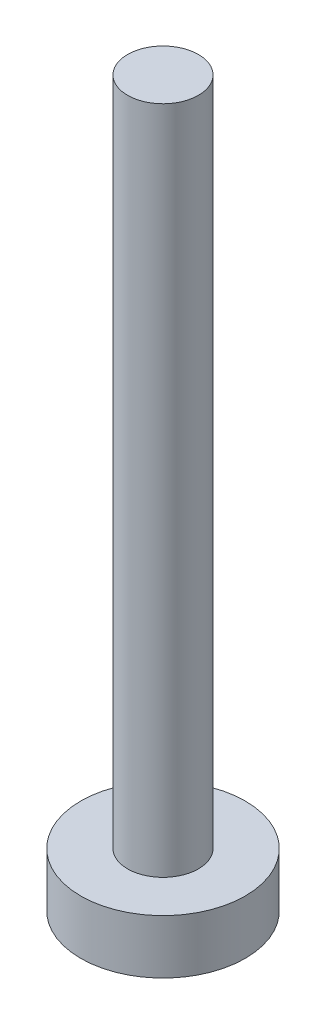
ISO-10303-21;
HEADER;
FILE_DESCRIPTION(('STEP AP214'),'2;1');
FILE_NAME('part.step','',(''),(''),'','','');
FILE_SCHEMA(('AUTOMOTIVE_DESIGN { 1 0 10303 214 1 1 1 1 }'));
ENDSEC;
DATA;
#1=APPLICATION_CONTEXT('core data for automotive mechanical design processes');
#2=APPLICATION_PROTOCOL_DEFINITION('international standard','automotive_design',2000,#1);
#3=PRODUCT_CONTEXT('',#1,'mechanical');
#4=PRODUCT('Part','Part','',(#3));
#5=PRODUCT_RELATED_PRODUCT_CATEGORY('part','',(#4));
#6=PRODUCT_DEFINITION_FORMATION('','',#4);
#7=PRODUCT_DEFINITION_CONTEXT('part definition',#1,'design');
#8=PRODUCT_DEFINITION('design','',#6,#7);
#9=PRODUCT_DEFINITION_SHAPE('','',#8);
#10=(LENGTH_UNIT() NAMED_UNIT(*) SI_UNIT(.MILLI.,.METRE.));
#11=(NAMED_UNIT(*) PLANE_ANGLE_UNIT() SI_UNIT($,.RADIAN.));
#12=(NAMED_UNIT(*) SI_UNIT($,.STERADIAN.) SOLID_ANGLE_UNIT());
#13=UNCERTAINTY_MEASURE_WITH_UNIT(LENGTH_MEASURE(1.E-05),#10,'distance_accuracy_value','');
#14=(GEOMETRIC_REPRESENTATION_CONTEXT(3) GLOBAL_UNCERTAINTY_ASSIGNED_CONTEXT((#13)) GLOBAL_UNIT_ASSIGNED_CONTEXT((#10,
#11,#12)) REPRESENTATION_CONTEXT('',''));
#15=CARTESIAN_POINT('',(0.,0.,0.));
#16=DIRECTION('',(0.,0.,1.));
#17=DIRECTION('',(1.,0.,0.));
#18=AXIS2_PLACEMENT_3D('',#15,#16,#17);
#19=CARTESIAN_POINT('',(0.,0.96,0.));
#20=DIRECTION('',(0.,-1.,0.));
#21=DIRECTION('',(0.,0.,-1.));
#22=AXIS2_PLACEMENT_3D('',#19,#20,#21);
#23=CYLINDRICAL_SURFACE('',#22,1.46);
#24=CARTESIAN_POINT('',(0.,0.96,0.));
#25=DIRECTION('',(0.,1.,0.));
#26=DIRECTION('',(0.,0.,1.));
#27=AXIS2_PLACEMENT_3D('',#24,#25,#26);
#28=CIRCLE('',#27,1.46);
#29=CARTESIAN_POINT('',(0.,0.96,1.46));
#30=VERTEX_POINT('',#29);
#31=EDGE_CURVE('E45',#30,#30,#28,.T.);
#32=ORIENTED_EDGE('',*,*,#31,.F.);
#33=EDGE_LOOP('',(#32));
#34=FACE_BOUND('',#33,.T.);
#35=CARTESIAN_POINT('',(0.,0.,0.));
#36=DIRECTION('',(0.,1.,0.));
#37=DIRECTION('',(0.,0.,1.));
#38=AXIS2_PLACEMENT_3D('',#35,#36,#37);
#39=CIRCLE('',#38,1.46);
#40=CARTESIAN_POINT('',(0.,0.,1.46));
#41=VERTEX_POINT('',#40);
#42=EDGE_CURVE('E40',#41,#41,#39,.T.);
#43=ORIENTED_EDGE('',*,*,#42,.T.);
#44=EDGE_LOOP('',(#43));
#45=FACE_BOUND('',#44,.T.);
#46=ADVANCED_FACE('F37',(#34,#45),#23,.T.);
#47=CARTESIAN_POINT('',(0.,0.96,0.));
#48=DIRECTION('',(0.,1.,0.));
#49=DIRECTION('',(0.,0.,1.));
#50=AXIS2_PLACEMENT_3D('',#47,#48,#49);
#51=PLANE('',#50);
#52=CARTESIAN_POINT('',(0.,0.959999999999999,0.));
#53=DIRECTION('',(0.,1.,0.));
#54=DIRECTION('',(0.,0.,1.));
#55=AXIS2_PLACEMENT_3D('',#52,#53,#54);
#56=CIRCLE('',#55,0.628287375833742);
#57=CARTESIAN_POINT('',(0.,0.959999999999999,0.628287375833742));
#58=VERTEX_POINT('',#57);
#59=EDGE_CURVE('E10',#58,#58,#56,.T.);
#60=ORIENTED_EDGE('',*,*,#59,.F.);
#61=EDGE_LOOP('',(#60));
#62=FACE_BOUND('',#61,.T.);
#63=ORIENTED_EDGE('',*,*,#31,.T.);
#64=EDGE_LOOP('',(#63));
#65=FACE_BOUND('',#64,.T.);
#66=ADVANCED_FACE('F65',(#62,#65),#51,.T.);
#67=CARTESIAN_POINT('',(0.,0.,0.));
#68=DIRECTION('',(0.,1.,0.));
#69=DIRECTION('',(0.,0.,1.));
#70=AXIS2_PLACEMENT_3D('',#67,#68,#69);
#71=PLANE('',#70);
#72=ORIENTED_EDGE('',*,*,#42,.F.);
#73=EDGE_LOOP('',(#72));
#74=FACE_BOUND('',#73,.T.);
#75=ADVANCED_FACE('F62',(#74),#71,.F.);
#76=CARTESIAN_POINT('',(0.,12.85,0.));
#77=DIRECTION('',(0.,-1.,0.));
#78=DIRECTION('',(0.,0.,-1.));
#79=AXIS2_PLACEMENT_3D('',#76,#77,#78);
#80=CYLINDRICAL_SURFACE('',#79,0.628287375833742);
#81=ORIENTED_EDGE('',*,*,#59,.T.);
#82=EDGE_LOOP('',(#81));
#83=FACE_BOUND('',#82,.T.);
#84=CARTESIAN_POINT('',(0.,12.85,0.));
#85=DIRECTION('',(0.,-1.,0.));
#86=DIRECTION('',(0.,0.,-1.));
#87=AXIS2_PLACEMENT_3D('',#84,#85,#86);
#88=CIRCLE('',#87,0.628287375833742);
#89=CARTESIAN_POINT('',(0.,12.85,-0.628287375833742));
#90=VERTEX_POINT('',#89);
#91=EDGE_CURVE('E52',#90,#90,#88,.T.);
#92=ORIENTED_EDGE('',*,*,#91,.T.);
#93=EDGE_LOOP('',(#92));
#94=FACE_BOUND('',#93,.T.);
#95=ADVANCED_FACE('F64',(#83,#94),#80,.T.);
#96=CARTESIAN_POINT('',(0.,12.85,0.));
#97=DIRECTION('',(0.,-1.,0.));
#98=DIRECTION('',(0.,0.,-1.));
#99=AXIS2_PLACEMENT_3D('',#96,#97,#98);
#100=PLANE('',#99);
#101=ORIENTED_EDGE('',*,*,#91,.F.);
#102=EDGE_LOOP('',(#101));
#103=FACE_BOUND('',#102,.T.);
#104=ADVANCED_FACE('F70',(#103),#100,.F.);
#105=CLOSED_SHELL('',(#46,#66,#75,#95,#104));
#106=MANIFOLD_SOLID_BREP('B2',#105);
#107=ADVANCED_BREP_SHAPE_REPRESENTATION('',(#18,#106),#14);
#108=SHAPE_DEFINITION_REPRESENTATION(#9,#107);
ENDSEC;
END-ISO-10303-21;
